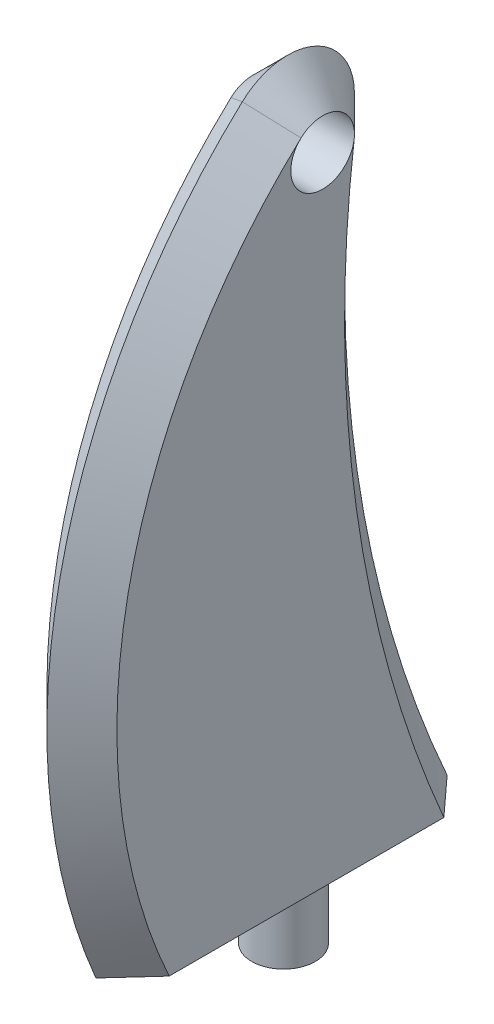
ISO-10303-21;
HEADER;
FILE_DESCRIPTION(('STEP AP214'),'2;1');
FILE_NAME('part.step','',(''),(''),'','','');
FILE_SCHEMA(('AUTOMOTIVE_DESIGN { 1 0 10303 214 1 1 1 1 }'));
ENDSEC;
DATA;
#1=APPLICATION_CONTEXT('core data for automotive mechanical design processes');
#2=APPLICATION_PROTOCOL_DEFINITION('international standard','automotive_design',2000,#1);
#3=PRODUCT_CONTEXT('',#1,'mechanical');
#4=PRODUCT('Part','Part','',(#3));
#5=PRODUCT_RELATED_PRODUCT_CATEGORY('part','',(#4));
#6=PRODUCT_DEFINITION_FORMATION('','',#4);
#7=PRODUCT_DEFINITION_CONTEXT('part definition',#1,'design');
#8=PRODUCT_DEFINITION('design','',#6,#7);
#9=PRODUCT_DEFINITION_SHAPE('','',#8);
#10=(LENGTH_UNIT() NAMED_UNIT(*) SI_UNIT(.MILLI.,.METRE.));
#11=(NAMED_UNIT(*) PLANE_ANGLE_UNIT() SI_UNIT($,.RADIAN.));
#12=(NAMED_UNIT(*) SI_UNIT($,.STERADIAN.) SOLID_ANGLE_UNIT());
#13=UNCERTAINTY_MEASURE_WITH_UNIT(LENGTH_MEASURE(1.E-05),#10,'distance_accuracy_value','');
#14=(GEOMETRIC_REPRESENTATION_CONTEXT(3) GLOBAL_UNCERTAINTY_ASSIGNED_CONTEXT((#13)) GLOBAL_UNIT_ASSIGNED_CONTEXT((#10,
#11,#12)) REPRESENTATION_CONTEXT('',''));
#15=CARTESIAN_POINT('',(0.,0.,0.));
#16=DIRECTION('',(0.,0.,1.));
#17=DIRECTION('',(1.,0.,0.));
#18=AXIS2_PLACEMENT_3D('',#15,#16,#17);
#19=CARTESIAN_POINT('',(-5.5,-63.4382441256907,34.3525553690539));
#20=DIRECTION('',(0.,-1.,0.));
#21=DIRECTION('',(0.,0.,-1.));
#22=AXIS2_PLACEMENT_3D('',#19,#20,#21);
#23=PLANE('',#22);
#24=CARTESIAN_POINT('',(0.,-63.4382441256907,0.));
#25=DIRECTION('',(0.,-1.,0.));
#26=DIRECTION('',(0.,0.,-1.));
#27=AXIS2_PLACEMENT_3D('',#24,#25,#26);
#28=CIRCLE('',#27,5.);
#29=CARTESIAN_POINT('',(0.,-63.4382441256907,-5.));
#30=VERTEX_POINT('',#29);
#31=EDGE_CURVE('E11',#30,#30,#28,.T.);
#32=ORIENTED_EDGE('',*,*,#31,.F.);
#33=EDGE_LOOP('',(#32));
#34=FACE_BOUND('',#33,.T.);
#35=CARTESIAN_POINT('',(5.5,-63.4382441256907,23.4620156735336));
#36=CARTESIAN_POINT('',(4.67136215981813,-63.4382441256907,24.3738628957778));
#37=CARTESIAN_POINT('',(3.84141132575669,-63.4382441256907,25.2845158506985));
#38=CARTESIAN_POINT('',(2.17910051416056,-63.4382441256907,27.1036104807534));
#39=CARTESIAN_POINT('',(1.34674055100668,-63.4382441256907,28.012052169028));
#40=CARTESIAN_POINT('',(-0.320180817721318,-63.4382441256907,29.8269115806795));
#41=CARTESIAN_POINT('',(-1.15474222135535,-63.4382441256907,30.7333293058388));
#42=CARTESIAN_POINT('',(-2.82589457658504,-63.4382441256907,32.5443020076213));
#43=CARTESIAN_POINT('',(-3.66248554023725,-63.4382441256907,33.4488569731196));
#44=CARTESIAN_POINT('',(-4.49999999999999,-63.4382441256907,34.3525553690539));
#45=B_SPLINE_CURVE_WITH_KNOTS('',3,(#35,#36,#37,#38,#39,#40,#41,#42,#43,#44),.UNSPECIFIED.,.F.,
.F.,(4,2,2,2,4),(0.,3.69634092230017,7.39265982535835,11.0889754720011,14.785313130535),.UNSPECIFIED.);
#46=CARTESIAN_POINT('',(5.5,-63.4382441256907,23.4620156735336));
#47=VERTEX_POINT('',#46);
#48=CARTESIAN_POINT('',(0.,-63.4382441256907,29.4780369629524));
#49=VERTEX_POINT('',#48);
#50=EDGE_CURVE('E126',#47,#49,#45,.T.);
#51=ORIENTED_EDGE('',*,*,#50,.T.);
#52=CARTESIAN_POINT('',(0.,-63.4382441256907,29.4780369629524));
#53=CARTESIAN_POINT('',(-0.459740913375047,-63.4382441256907,28.9779902091749));
#54=CARTESIAN_POINT('',(-0.919153275080425,-63.4382441256907,28.4776413001377));
#55=CARTESIAN_POINT('',(-1.83728553048909,-63.4382441256907,27.4763105031746));
#56=CARTESIAN_POINT('',(-2.2960054256474,-63.4382441256907,26.9753286165829));
#57=CARTESIAN_POINT('',(-3.21271939884326,-63.4382441256907,25.9727010039711));
#58=CARTESIAN_POINT('',(-3.67071347675328,-63.4382441256907,25.4710552778346));
#59=CARTESIAN_POINT('',(-4.58593869020867,-63.4382441256907,24.4670664187152));
#60=CARTESIAN_POINT('',(-5.04316982414657,-63.4382441256907,23.964723284267));
#61=CARTESIAN_POINT('',(-5.5,-63.4382441256907,23.4620156735335));
#62=B_SPLINE_CURVE_WITH_KNOTS('',3,(#52,#53,#54,#55,#56,#57,#58,#59,#60,#61),.UNSPECIFIED.,.F.,
.F.,(4,2,2,2,4),(0.,2.03781155766868,4.07561882747771,6.11342645530345,8.15123837124693),.UNSPECIFIED.);
#63=CARTESIAN_POINT('',(-5.5,-63.4382441256907,23.4620156735335));
#64=VERTEX_POINT('',#63);
#65=EDGE_CURVE('E168',#49,#64,#62,.T.);
#66=ORIENTED_EDGE('',*,*,#65,.T.);
#67=DIRECTION('',(0.,0.,-1.));
#68=VECTOR('',#67,1.);
#69=CARTESIAN_POINT('',(-5.5,-63.4382441256907,34.3525553690539));
#70=LINE('',#69,#68);
#71=CARTESIAN_POINT('',(-5.5,-63.4382441256907,-19.6954555227958));
#72=VERTEX_POINT('',#71);
#73=EDGE_CURVE('E226',#64,#72,#70,.T.);
#74=ORIENTED_EDGE('',*,*,#73,.T.);
#75=CARTESIAN_POINT('',(-5.5,-63.4382441256907,-19.6954555227958));
#76=CARTESIAN_POINT('',(-4.58191493405099,-63.4382441256907,-20.6956463515037));
#77=CARTESIAN_POINT('',(-3.66453907111351,-63.4382441256907,-21.6964863163382));
#78=CARTESIAN_POINT('',(-1.83120573775927,-63.4382441256907,-23.699464533012));
#79=CARTESIAN_POINT('',(-0.915248267363394,-63.4382441256907,-24.7016027848706));
#80=CARTESIAN_POINT('',(0.,-63.4382441256907,-25.7043901728748));
#81=B_SPLINE_CURVE_WITH_KNOTS('',3,(#75,#76,#77,#78,#79,#80),.UNSPECIFIED.,.F.,.F.,(4,2,4),(0.,
4.07300036606818,8.14600079213107),.UNSPECIFIED.);
#82=CARTESIAN_POINT('',(0.,-63.4382441256907,-25.7043901728748));
#83=VERTEX_POINT('',#82);
#84=EDGE_CURVE('E68',#72,#83,#81,.T.);
#85=ORIENTED_EDGE('',*,*,#84,.T.);
#86=CARTESIAN_POINT('',(-4.50000000000001,-63.4382441256907,-30.6474446309461));
#87=CARTESIAN_POINT('',(-3.66919169950392,-63.4382441256907,-29.7324759908675));
#88=CARTESIAN_POINT('',(-2.837713553443,-63.4382441256907,-28.8181157374749));
#89=CARTESIAN_POINT('',(-1.173477280148,-63.4382441256907,-26.9905638167239));
#90=CARTESIAN_POINT('',(-0.340719155223153,-63.4382441256907,-26.0773721472628));
#91=CARTESIAN_POINT('',(1.32602024617107,-63.4382441256907,-24.2521060350476));
#92=CARTESIAN_POINT('',(2.16000152247262,-63.4382441256907,-23.3400315921402));
#93=CARTESIAN_POINT('',(3.82913570076103,-63.4382441256907,-21.5169523574966));
#94=CARTESIAN_POINT('',(4.66428860485636,-63.4382441256907,-20.6059475676908));
#95=CARTESIAN_POINT('',(5.49999999999999,-63.4382441256907,-19.6954555227959));
#96=B_SPLINE_CURVE_WITH_KNOTS('',3,(#86,#87,#88,#89,#90,#91,#92,#93,#94,#95),.UNSPECIFIED.,.F.,
.F.,(4,2,2,2,4),(0.,3.70765245419747,7.41529822717785,11.1229434914748,14.8305954366834),.UNSPECIFIED.);
#97=CARTESIAN_POINT('',(5.5,-63.4382441256907,-19.6954555227959));
#98=VERTEX_POINT('',#97);
#99=EDGE_CURVE('E128',#83,#98,#96,.T.);
#100=ORIENTED_EDGE('',*,*,#99,.T.);
#101=DIRECTION('',(0.,0.,-1.));
#102=VECTOR('',#101,1.);
#103=CARTESIAN_POINT('',(5.5,-63.4382441256907,34.3525553690539));
#104=LINE('',#103,#102);
#105=EDGE_CURVE('E230',#47,#98,#104,.T.);
#106=ORIENTED_EDGE('',*,*,#105,.F.);
#107=EDGE_LOOP('',(#51,#66,#74,#85,#100,#106));
#108=FACE_BOUND('',#107,.T.);
#109=ADVANCED_FACE('F41',(#34,#108),#23,.T.);
#110=CARTESIAN_POINT('',(-5.5,11.969683581169,-194.090536987145));
#111=DIRECTION('',(1.,0.,0.));
#112=DIRECTION('',(0.,0.,-1.));
#113=AXIS2_PLACEMENT_3D('',#110,#111,#112);
#114=PLANE('',#113);
#115=ORIENTED_EDGE('',*,*,#73,.F.);
#116=CARTESIAN_POINT('',(-5.5,-25.8751742023295,-58.3243877070569));
#117=DIRECTION('',(1.,0.,0.));
#118=DIRECTION('',(0.,0.,-1.));
#119=AXIS2_PLACEMENT_3D('',#116,#117,#118);
#120=CIRCLE('',#119,89.9999999999998);
#121=CARTESIAN_POINT('',(-5.5,40.2345164670526,2.74531672647205));
#122=VERTEX_POINT('',#121);
#123=EDGE_CURVE('E155',#64,#122,#120,.F.);
#124=ORIENTED_EDGE('',*,*,#123,.T.);
#125=CARTESIAN_POINT('',(-5.5,36.5617558743093,-0.647444630946124));
#126=DIRECTION('',(1.,0.,0.));
#127=DIRECTION('',(0.,0.,-1.));
#128=AXIS2_PLACEMENT_3D('',#125,#126,#127);
#129=CIRCLE('',#128,4.99999999999983);
#130=CARTESIAN_POINT('',(-5.5,35.9311899180749,-5.60752392213057));
#131=VERTEX_POINT('',#130);
#132=EDGE_CURVE('E152',#122,#131,#129,.F.);
#133=ORIENTED_EDGE('',*,*,#132,.T.);
#134=CARTESIAN_POINT('',(-5.5,11.969683581169,-194.090536987145));
#135=DIRECTION('',(1.,0.,0.));
#136=DIRECTION('',(0.,0.,-1.));
#137=AXIS2_PLACEMENT_3D('',#134,#135,#136);
#138=CIRCLE('',#137,190.);
#139=EDGE_CURVE('E149',#131,#72,#138,.T.);
#140=ORIENTED_EDGE('',*,*,#139,.T.);
#141=EDGE_LOOP('',(#115,#124,#133,#140));
#142=FACE_BOUND('',#141,.T.);
#143=ADVANCED_FACE('F178',(#142),#114,.F.);
#144=CARTESIAN_POINT('',(5.5,11.969683581169,-194.090536987145));
#145=DIRECTION('',(1.,0.,0.));
#146=DIRECTION('',(0.,0.,-1.));
#147=AXIS2_PLACEMENT_3D('',#144,#145,#146);
#148=PLANE('',#147);
#149=CARTESIAN_POINT('',(5.5,36.5617558743093,-0.647444630946124));
#150=DIRECTION('',(1.,0.,0.));
#151=DIRECTION('',(0.,0.,-1.));
#152=AXIS2_PLACEMENT_3D('',#149,#150,#151);
#153=CIRCLE('',#152,5.);
#154=CARTESIAN_POINT('',(5.5,40.2345164670527,2.74531672647218));
#155=VERTEX_POINT('',#154);
#156=CARTESIAN_POINT('',(5.5,35.9311899180749,-5.60752392213071));
#157=VERTEX_POINT('',#156);
#158=EDGE_CURVE('E103',#155,#157,#153,.T.);
#159=ORIENTED_EDGE('',*,*,#158,.F.);
#160=CARTESIAN_POINT('',(5.5,-25.8751742023295,-58.3243877070569));
#161=DIRECTION('',(1.,0.,0.));
#162=DIRECTION('',(0.,0.,-1.));
#163=AXIS2_PLACEMENT_3D('',#160,#161,#162);
#164=CIRCLE('',#163,90.);
#165=EDGE_CURVE('E113',#155,#47,#164,.T.);
#166=ORIENTED_EDGE('',*,*,#165,.T.);
#167=ORIENTED_EDGE('',*,*,#105,.T.);
#168=CARTESIAN_POINT('',(5.5,11.969683581169,-194.090536987145));
#169=DIRECTION('',(1.,0.,0.));
#170=DIRECTION('',(0.,0.,-1.));
#171=AXIS2_PLACEMENT_3D('',#168,#169,#170);
#172=CIRCLE('',#171,190.);
#173=EDGE_CURVE('E116',#98,#157,#172,.F.);
#174=ORIENTED_EDGE('',*,*,#173,.T.);
#175=EDGE_LOOP('',(#159,#166,#167,#174));
#176=FACE_BOUND('',#175,.T.);
#177=ADVANCED_FACE('F111',(#176),#148,.T.);
#178=CARTESIAN_POINT('',(-4.5,36.5617558743093,-0.647444630946124));
#179=DIRECTION('',(1.,0.,0.));
#180=DIRECTION('',(0.,0.,-1.));
#181=AXIS2_PLACEMENT_3D('',#178,#179,#180);
#182=CYLINDRICAL_SURFACE('',#181,5.);
#183=CARTESIAN_POINT('',(-4.5,36.5617558743093,-0.647444630946124));
#184=DIRECTION('',(1.,0.,0.));
#185=DIRECTION('',(0.,0.,-1.));
#186=AXIS2_PLACEMENT_3D('',#183,#184,#185);
#187=CIRCLE('',#186,5.);
#188=CARTESIAN_POINT('',(-4.5,36.5617558743093,-5.64744463094612));
#189=VERTEX_POINT('',#188);
#190=EDGE_CURVE('E118',#189,#189,#187,.T.);
#191=ORIENTED_EDGE('',*,*,#190,.F.);
#192=EDGE_LOOP('',(#191));
#193=FACE_BOUND('',#192,.T.);
#194=ORIENTED_EDGE('',*,*,#158,.T.);
#195=EDGE_CURVE('E100',#157,#155,#153,.T.);
#196=ORIENTED_EDGE('',*,*,#195,.T.);
#197=EDGE_LOOP('',(#194,#196));
#198=FACE_BOUND('',#197,.T.);
#199=ADVANCED_FACE('F102',(#193,#198),#182,.F.);
#200=CARTESIAN_POINT('',(-4.5,36.5617558743093,-0.647444630946124));
#201=DIRECTION('',(1.,0.,0.));
#202=DIRECTION('',(0.,0.,-1.));
#203=AXIS2_PLACEMENT_3D('',#200,#201,#202);
#204=PLANE('',#203);
#205=ORIENTED_EDGE('',*,*,#190,.T.);
#206=EDGE_LOOP('',(#205));
#207=FACE_BOUND('',#206,.T.);
#208=ADVANCED_FACE('F201',(#207),#204,.T.);
#209=CARTESIAN_POINT('',(-4.50000000000001,11.969683581169,-194.090536987145));
#210=DIRECTION('',(1.,0.,0.));
#211=DIRECTION('',(0.,0.,-1.));
#212=AXIS2_PLACEMENT_3D('',#209,#210,#211);
#213=CONICAL_SURFACE('',#212,180.,0.78539816339745);
#214=ORIENTED_EDGE('',*,*,#99,.F.);
#215=CARTESIAN_POINT('',(0.,11.969683581169,-194.090536987145));
#216=DIRECTION('',(-1.,0.,0.));
#217=DIRECTION('',(0.,0.,1.));
#218=AXIS2_PLACEMENT_3D('',#215,#216,#217);
#219=CIRCLE('',#218,184.5);
#220=CARTESIAN_POINT('',(0.,35.2375673662171,-11.0636111424337));
#221=VERTEX_POINT('',#220);
#222=EDGE_CURVE('E53',#83,#221,#219,.T.);
#223=ORIENTED_EDGE('',*,*,#222,.T.);
#224=DIRECTION('',(-0.707106781186547,-0.0891754927277403,-0.701461140403918));
#225=VECTOR('',#224,1.);
#226=CARTESIAN_POINT('',(5.5,35.9311899180749,-5.60752392213071));
#227=LINE('',#226,#225);
#228=EDGE_CURVE('E107',#157,#221,#227,.T.);
#229=ORIENTED_EDGE('',*,*,#228,.F.);
#230=ORIENTED_EDGE('',*,*,#173,.F.);
#231=EDGE_LOOP('',(#214,#223,#229,#230));
#232=FACE_BOUND('',#231,.T.);
#233=ADVANCED_FACE('F195',(#232),#213,.F.);
#234=CARTESIAN_POINT('',(5.5,36.5617558743093,-0.647444630946124));
#235=DIRECTION('',(-1.,0.,0.));
#236=DIRECTION('',(0.,0.,1.));
#237=AXIS2_PLACEMENT_3D('',#234,#235,#236);
#238=CONICAL_SURFACE('',#237,4.99999999999996,0.78539816339745);
#239=ORIENTED_EDGE('',*,*,#228,.T.);
#240=CARTESIAN_POINT('',(0.,36.5617558743093,-0.647444630946124));
#241=DIRECTION('',(1.,0.,0.));
#242=DIRECTION('',(0.,0.,-1.));
#243=AXIS2_PLACEMENT_3D('',#240,#241,#242);
#244=CIRCLE('',#243,10.4999999999999);
#245=CARTESIAN_POINT('',(0.,44.2745531190705,6.47735421963224));
#246=VERTEX_POINT('',#245);
#247=EDGE_CURVE('E132',#221,#246,#244,.T.);
#248=ORIENTED_EDGE('',*,*,#247,.T.);
#249=DIRECTION('',(-0.707106781186546,0.519406784160725,0.479808912555629));
#250=VECTOR('',#249,1.);
#251=CARTESIAN_POINT('',(5.5,40.2345164670527,2.74531672647215));
#252=LINE('',#251,#250);
#253=EDGE_CURVE('E123',#155,#246,#252,.T.);
#254=ORIENTED_EDGE('',*,*,#253,.F.);
#255=ORIENTED_EDGE('',*,*,#195,.F.);
#256=EDGE_LOOP('',(#239,#248,#254,#255));
#257=FACE_BOUND('',#256,.T.);
#258=ADVANCED_FACE('F130',(#257),#238,.T.);
#259=CARTESIAN_POINT('',(-4.50000000000001,-25.8751742023295,-58.3243877070569));
#260=DIRECTION('',(-1.,0.,0.));
#261=DIRECTION('',(0.,0.,1.));
#262=AXIS2_PLACEMENT_3D('',#259,#260,#261);
#263=CONICAL_SURFACE('',#262,100.,0.78539816339745);
#264=ORIENTED_EDGE('',*,*,#253,.T.);
#265=CARTESIAN_POINT('',(1.2490009027033E-13,-25.8751742023295,-58.3243877070569));
#266=DIRECTION('',(1.,0.,0.));
#267=DIRECTION('',(0.,0.,-1.));
#268=AXIS2_PLACEMENT_3D('',#265,#266,#267);
#269=CIRCLE('',#268,95.4999999999999);
#270=EDGE_CURVE('E159',#246,#49,#269,.T.);
#271=ORIENTED_EDGE('',*,*,#270,.T.);
#272=ORIENTED_EDGE('',*,*,#50,.F.);
#273=ORIENTED_EDGE('',*,*,#165,.F.);
#274=EDGE_LOOP('',(#264,#271,#272,#273));
#275=FACE_BOUND('',#274,.T.);
#276=ADVANCED_FACE('F122',(#275),#263,.T.);
#277=CARTESIAN_POINT('',(-5.5,11.969683581169,-194.090536987145));
#278=DIRECTION('',(-1.,0.,0.));
#279=DIRECTION('',(0.,0.,1.));
#280=AXIS2_PLACEMENT_3D('',#277,#278,#279);
#281=CONICAL_SURFACE('',#280,190.,0.785398163397453);
#282=ORIENTED_EDGE('',*,*,#84,.F.);
#283=ORIENTED_EDGE('',*,*,#139,.F.);
#284=DIRECTION('',(-0.707106781186545,0.0891754927277399,0.70146114040392));
#285=VECTOR('',#284,1.);
#286=CARTESIAN_POINT('',(4.50000000000007,34.6700580056062,-15.5276825044999));
#287=LINE('',#286,#285);
#288=EDGE_CURVE('E47',#221,#131,#287,.T.);
#289=ORIENTED_EDGE('',*,*,#288,.F.);
#290=ORIENTED_EDGE('',*,*,#222,.F.);
#291=EDGE_LOOP('',(#282,#283,#289,#290));
#292=FACE_BOUND('',#291,.T.);
#293=ADVANCED_FACE('F44',(#292),#281,.F.);
#294=CARTESIAN_POINT('',(4.50000000000007,36.5617558743093,-0.647444630946124));
#295=DIRECTION('',(1.,0.,0.));
#296=DIRECTION('',(0.,0.,-1.));
#297=AXIS2_PLACEMENT_3D('',#294,#295,#296);
#298=CONICAL_SURFACE('',#297,15.,0.785398163397453);
#299=ORIENTED_EDGE('',*,*,#288,.T.);
#300=ORIENTED_EDGE('',*,*,#132,.F.);
#301=DIRECTION('',(-0.707106781186544,-0.519406784160726,-0.479808912555632));
#302=VECTOR('',#301,1.);
#303=CARTESIAN_POINT('',(4.50000000000007,47.5800376525396,9.53083944130874));
#304=LINE('',#303,#302);
#305=EDGE_CURVE('E139',#246,#122,#304,.T.);
#306=ORIENTED_EDGE('',*,*,#305,.F.);
#307=ORIENTED_EDGE('',*,*,#247,.F.);
#308=EDGE_LOOP('',(#299,#300,#306,#307));
#309=FACE_BOUND('',#308,.T.);
#310=ADVANCED_FACE('F210',(#309),#298,.T.);
#311=CARTESIAN_POINT('',(-5.5,-25.8751742023295,-58.3243877070569));
#312=DIRECTION('',(1.,0.,0.));
#313=DIRECTION('',(0.,0.,-1.));
#314=AXIS2_PLACEMENT_3D('',#311,#312,#313);
#315=CONICAL_SURFACE('',#314,89.9999999999998,0.785398163397453);
#316=ORIENTED_EDGE('',*,*,#65,.F.);
#317=ORIENTED_EDGE('',*,*,#270,.F.);
#318=ORIENTED_EDGE('',*,*,#305,.T.);
#319=ORIENTED_EDGE('',*,*,#123,.F.);
#320=EDGE_LOOP('',(#316,#317,#318,#319));
#321=FACE_BOUND('',#320,.T.);
#322=ADVANCED_FACE('F203',(#321),#315,.T.);
#323=CARTESIAN_POINT('',(0.,-73.4382441256907,0.));
#324=DIRECTION('',(0.,1.,0.));
#325=DIRECTION('',(0.,0.,1.));
#326=AXIS2_PLACEMENT_3D('',#323,#324,#325);
#327=CYLINDRICAL_SURFACE('',#326,5.);
#328=CARTESIAN_POINT('',(0.,-73.4382441256907,0.));
#329=DIRECTION('',(0.,-1.,0.));
#330=DIRECTION('',(0.,0.,-1.));
#331=AXIS2_PLACEMENT_3D('',#328,#329,#330);
#332=CIRCLE('',#331,5.);
#333=CARTESIAN_POINT('',(0.,-73.4382441256907,-5.));
#334=VERTEX_POINT('',#333);
#335=EDGE_CURVE('E239',#334,#334,#332,.T.);
#336=ORIENTED_EDGE('',*,*,#335,.F.);
#337=EDGE_LOOP('',(#336));
#338=FACE_BOUND('',#337,.T.);
#339=ORIENTED_EDGE('',*,*,#31,.T.);
#340=EDGE_LOOP('',(#339));
#341=FACE_BOUND('',#340,.T.);
#342=ADVANCED_FACE('F209',(#338,#341),#327,.T.);
#343=CARTESIAN_POINT('',(0.,-73.4382441256907,0.));
#344=DIRECTION('',(0.,-1.,0.));
#345=DIRECTION('',(0.,0.,-1.));
#346=AXIS2_PLACEMENT_3D('',#343,#344,#345);
#347=PLANE('',#346);
#348=ORIENTED_EDGE('',*,*,#335,.T.);
#349=EDGE_LOOP('',(#348));
#350=FACE_BOUND('',#349,.T.);
#351=ADVANCED_FACE('F250',(#350),#347,.T.);
#352=CLOSED_SHELL('',(#109,#143,#177,#199,#208,#233,#258,#276,#293,#310,#322,#342,#351));
#353=MANIFOLD_SOLID_BREP('B2',#352);
#354=ADVANCED_BREP_SHAPE_REPRESENTATION('',(#18,#353),#14);
#355=SHAPE_DEFINITION_REPRESENTATION(#9,#354);
ENDSEC;
END-ISO-10303-21;
